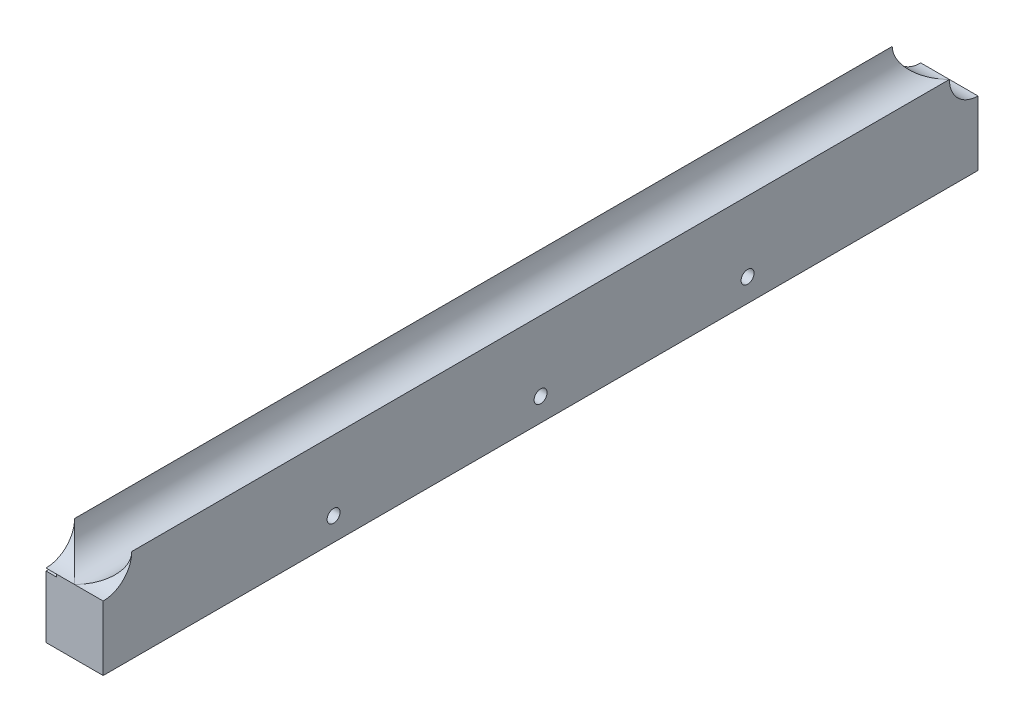
ISO-10303-21;
HEADER;
FILE_DESCRIPTION(('STEP AP214'),'2;1');
FILE_NAME('part.step','',(''),(''),'','','');
FILE_SCHEMA(('AUTOMOTIVE_DESIGN { 1 0 10303 214 1 1 1 1 }'));
ENDSEC;
DATA;
#1=APPLICATION_CONTEXT('core data for automotive mechanical design processes');
#2=APPLICATION_PROTOCOL_DEFINITION('international standard','automotive_design',2000,#1);
#3=PRODUCT_CONTEXT('',#1,'mechanical');
#4=PRODUCT('Part','Part','',(#3));
#5=PRODUCT_RELATED_PRODUCT_CATEGORY('part','',(#4));
#6=PRODUCT_DEFINITION_FORMATION('','',#4);
#7=PRODUCT_DEFINITION_CONTEXT('part definition',#1,'design');
#8=PRODUCT_DEFINITION('design','',#6,#7);
#9=PRODUCT_DEFINITION_SHAPE('','',#8);
#10=(LENGTH_UNIT() NAMED_UNIT(*) SI_UNIT(.MILLI.,.METRE.));
#11=(NAMED_UNIT(*) PLANE_ANGLE_UNIT() SI_UNIT($,.RADIAN.));
#12=(NAMED_UNIT(*) SI_UNIT($,.STERADIAN.) SOLID_ANGLE_UNIT());
#13=UNCERTAINTY_MEASURE_WITH_UNIT(LENGTH_MEASURE(1.E-05),#10,'distance_accuracy_value','');
#14=(GEOMETRIC_REPRESENTATION_CONTEXT(3) GLOBAL_UNCERTAINTY_ASSIGNED_CONTEXT((#13)) GLOBAL_UNIT_ASSIGNED_CONTEXT((#10,
#11,#12)) REPRESENTATION_CONTEXT('',''));
#15=CARTESIAN_POINT('',(0.,0.,0.));
#16=DIRECTION('',(0.,0.,1.));
#17=DIRECTION('',(1.,0.,0.));
#18=AXIS2_PLACEMENT_3D('',#15,#16,#17);
#19=CARTESIAN_POINT('',(-11.05,36.,-169.05));
#20=DIRECTION('',(1.,0.,0.));
#21=DIRECTION('',(0.,0.,-1.));
#22=AXIS2_PLACEMENT_3D('',#19,#20,#21);
#23=PLANE('',#22);
#24=CARTESIAN_POINT('',(-11.05,8.94000000000001,-80.));
#25=DIRECTION('',(1.,0.,0.));
#26=DIRECTION('',(0.,0.,-1.));
#27=AXIS2_PLACEMENT_3D('',#24,#25,#26);
#28=CIRCLE('',#27,2.49999999999998);
#29=CARTESIAN_POINT('',(-11.05,8.94000000000001,-82.5));
#30=VERTEX_POINT('',#29);
#31=EDGE_CURVE('E149',#30,#30,#28,.T.);
#32=ORIENTED_EDGE('',*,*,#31,.T.);
#33=EDGE_LOOP('',(#32));
#34=FACE_BOUND('',#33,.T.);
#35=CARTESIAN_POINT('',(-11.05,8.93999999999999,0.));
#36=DIRECTION('',(1.,0.,0.));
#37=DIRECTION('',(0.,0.,-1.));
#38=AXIS2_PLACEMENT_3D('',#35,#36,#37);
#39=CIRCLE('',#38,2.49999999999998);
#40=CARTESIAN_POINT('',(-11.05,8.93999999999999,-2.49999999999998));
#41=VERTEX_POINT('',#40);
#42=EDGE_CURVE('E236',#41,#41,#39,.T.);
#43=ORIENTED_EDGE('',*,*,#42,.T.);
#44=EDGE_LOOP('',(#43));
#45=FACE_BOUND('',#44,.T.);
#46=CARTESIAN_POINT('',(-11.05,8.93999999999999,80.));
#47=DIRECTION('',(1.,0.,0.));
#48=DIRECTION('',(0.,0.,-1.));
#49=AXIS2_PLACEMENT_3D('',#46,#47,#48);
#50=CIRCLE('',#49,2.49999999999998);
#51=CARTESIAN_POINT('',(-11.05,8.93999999999999,77.5));
#52=VERTEX_POINT('',#51);
#53=EDGE_CURVE('E224',#52,#52,#50,.T.);
#54=ORIENTED_EDGE('',*,*,#53,.T.);
#55=EDGE_LOOP('',(#54));
#56=FACE_BOUND('',#55,.T.);
#57=DIRECTION('',(0.,-1.,0.));
#58=VECTOR('',#57,1.);
#59=CARTESIAN_POINT('',(-11.05,36.,169.05));
#60=LINE('',#59,#58);
#61=CARTESIAN_POINT('',(-11.0500000000001,23.95,169.05));
#62=VERTEX_POINT('',#61);
#63=CARTESIAN_POINT('',(-11.05,0.,169.05));
#64=VERTEX_POINT('',#63);
#65=EDGE_CURVE('E177',#62,#64,#60,.T.);
#66=ORIENTED_EDGE('',*,*,#65,.F.);
#67=DIRECTION('',(0.,0.,-1.));
#68=VECTOR('',#67,1.);
#69=CARTESIAN_POINT('',(-11.0500000000001,23.95,169.05));
#70=LINE('',#69,#68);
#71=CARTESIAN_POINT('',(-11.0500000000001,23.95,-169.05));
#72=VERTEX_POINT('',#71);
#73=EDGE_CURVE('E216',#62,#72,#70,.T.);
#74=ORIENTED_EDGE('',*,*,#73,.T.);
#75=DIRECTION('',(0.,-1.,0.));
#76=VECTOR('',#75,1.);
#77=CARTESIAN_POINT('',(-11.05,36.,-169.05));
#78=LINE('',#77,#76);
#79=CARTESIAN_POINT('',(-11.05,0.,-169.05));
#80=VERTEX_POINT('',#79);
#81=EDGE_CURVE('E179',#72,#80,#78,.T.);
#82=ORIENTED_EDGE('',*,*,#81,.T.);
#83=DIRECTION('',(0.,0.,1.));
#84=VECTOR('',#83,1.);
#85=CARTESIAN_POINT('',(-11.05,0.,-169.05));
#86=LINE('',#85,#84);
#87=EDGE_CURVE('E171',#80,#64,#86,.T.);
#88=ORIENTED_EDGE('',*,*,#87,.T.);
#89=EDGE_LOOP('',(#66,#74,#82,#88));
#90=FACE_BOUND('',#89,.T.);
#91=ADVANCED_FACE('F39',(#34,#45,#56,#90),#23,.F.);
#92=CARTESIAN_POINT('',(11.05,36.,-169.05));
#93=DIRECTION('',(-1.,0.,0.));
#94=DIRECTION('',(0.,0.,1.));
#95=AXIS2_PLACEMENT_3D('',#92,#93,#94);
#96=PLANE('',#95);
#97=CARTESIAN_POINT('',(11.05,8.93999999999999,80.));
#98=DIRECTION('',(1.,0.,0.));
#99=DIRECTION('',(0.,0.,-1.));
#100=AXIS2_PLACEMENT_3D('',#97,#98,#99);
#101=CIRCLE('',#100,2.49999999999999);
#102=CARTESIAN_POINT('',(11.05,8.93999999999999,77.5));
#103=VERTEX_POINT('',#102);
#104=EDGE_CURVE('E220',#103,#103,#101,.T.);
#105=ORIENTED_EDGE('',*,*,#104,.F.);
#106=EDGE_LOOP('',(#105));
#107=FACE_BOUND('',#106,.T.);
#108=CARTESIAN_POINT('',(11.05,8.93999999999999,0.));
#109=DIRECTION('',(1.,0.,0.));
#110=DIRECTION('',(0.,0.,-1.));
#111=AXIS2_PLACEMENT_3D('',#108,#109,#110);
#112=CIRCLE('',#111,2.49999999999999);
#113=CARTESIAN_POINT('',(11.05,8.93999999999999,-2.49999999999999));
#114=VERTEX_POINT('',#113);
#115=EDGE_CURVE('E233',#114,#114,#112,.T.);
#116=ORIENTED_EDGE('',*,*,#115,.F.);
#117=EDGE_LOOP('',(#116));
#118=FACE_BOUND('',#117,.T.);
#119=CARTESIAN_POINT('',(11.05,8.94000000000001,-80.));
#120=DIRECTION('',(1.,0.,0.));
#121=DIRECTION('',(0.,0.,-1.));
#122=AXIS2_PLACEMENT_3D('',#119,#120,#121);
#123=CIRCLE('',#122,2.49999999999999);
#124=CARTESIAN_POINT('',(11.05,8.94000000000001,-82.5));
#125=VERTEX_POINT('',#124);
#126=EDGE_CURVE('E238',#125,#125,#123,.T.);
#127=ORIENTED_EDGE('',*,*,#126,.F.);
#128=EDGE_LOOP('',(#127));
#129=FACE_BOUND('',#128,.T.);
#130=DIRECTION('',(0.,0.,-1.));
#131=VECTOR('',#130,1.);
#132=CARTESIAN_POINT('',(11.05,36.,-169.05));
#133=LINE('',#132,#131);
#134=CARTESIAN_POINT('',(11.05,36.,158.));
#135=VERTEX_POINT('',#134);
#136=CARTESIAN_POINT('',(11.05,36.,-158.));
#137=VERTEX_POINT('',#136);
#138=EDGE_CURVE('E158',#135,#137,#133,.T.);
#139=ORIENTED_EDGE('',*,*,#138,.F.);
#140=CARTESIAN_POINT('',(11.05,36.,169.05));
#141=DIRECTION('',(1.,0.,0.));
#142=DIRECTION('',(0.,0.,-1.));
#143=AXIS2_PLACEMENT_3D('',#140,#141,#142);
#144=CIRCLE('',#143,11.05);
#145=CARTESIAN_POINT('',(11.05,24.95,169.05));
#146=VERTEX_POINT('',#145);
#147=EDGE_CURVE('E143',#146,#135,#144,.T.);
#148=ORIENTED_EDGE('',*,*,#147,.F.);
#149=DIRECTION('',(0.,-1.,0.));
#150=VECTOR('',#149,1.);
#151=CARTESIAN_POINT('',(11.05,36.,169.05));
#152=LINE('',#151,#150);
#153=CARTESIAN_POINT('',(11.05,0.,169.05));
#154=VERTEX_POINT('',#153);
#155=EDGE_CURVE('E164',#146,#154,#152,.T.);
#156=ORIENTED_EDGE('',*,*,#155,.T.);
#157=DIRECTION('',(0.,0.,-1.));
#158=VECTOR('',#157,1.);
#159=CARTESIAN_POINT('',(11.05,0.,-169.05));
#160=LINE('',#159,#158);
#161=CARTESIAN_POINT('',(11.05,0.,-169.05));
#162=VERTEX_POINT('',#161);
#163=EDGE_CURVE('E165',#154,#162,#160,.T.);
#164=ORIENTED_EDGE('',*,*,#163,.T.);
#165=DIRECTION('',(0.,-1.,0.));
#166=VECTOR('',#165,1.);
#167=CARTESIAN_POINT('',(11.05,36.,-169.05));
#168=LINE('',#167,#166);
#169=CARTESIAN_POINT('',(11.05,24.95,-169.05));
#170=VERTEX_POINT('',#169);
#171=EDGE_CURVE('E181',#170,#162,#168,.T.);
#172=ORIENTED_EDGE('',*,*,#171,.F.);
#173=CARTESIAN_POINT('',(11.05,36.,-169.05));
#174=DIRECTION('',(1.,0.,0.));
#175=DIRECTION('',(0.,0.,-1.));
#176=AXIS2_PLACEMENT_3D('',#173,#174,#175);
#177=CIRCLE('',#176,11.05);
#178=EDGE_CURVE('E153',#137,#170,#177,.T.);
#179=ORIENTED_EDGE('',*,*,#178,.F.);
#180=EDGE_LOOP('',(#139,#148,#156,#164,#172,#179));
#181=FACE_BOUND('',#180,.T.);
#182=ADVANCED_FACE('F41',(#107,#118,#129,#181),#96,.F.);
#183=CARTESIAN_POINT('',(-11.05,36.,-169.05));
#184=DIRECTION('',(0.,0.,1.));
#185=DIRECTION('',(1.,0.,0.));
#186=AXIS2_PLACEMENT_3D('',#183,#184,#185);
#187=PLANE('',#186);
#188=CARTESIAN_POINT('',(5.52499999999999,17.9625,-169.05));
#189=DIRECTION('',(0.,0.,-1.));
#190=DIRECTION('',(-1.,0.,0.));
#191=AXIS2_PLACEMENT_3D('',#188,#189,#190);
#192=CIRCLE('',#191,2.5);
#193=CARTESIAN_POINT('',(3.02499999999999,17.9625,-169.05));
#194=VERTEX_POINT('',#193);
#195=EDGE_CURVE('E279',#194,#194,#192,.T.);
#196=ORIENTED_EDGE('',*,*,#195,.F.);
#197=EDGE_LOOP('',(#196));
#198=FACE_BOUND('',#197,.T.);
#199=CARTESIAN_POINT('',(-5.52500000000001,5.9875,-169.05));
#200=DIRECTION('',(0.,0.,-1.));
#201=DIRECTION('',(-1.,0.,0.));
#202=AXIS2_PLACEMENT_3D('',#199,#200,#201);
#203=CIRCLE('',#202,2.5);
#204=CARTESIAN_POINT('',(-8.02500000000001,5.9875,-169.05));
#205=VERTEX_POINT('',#204);
#206=EDGE_CURVE('E282',#205,#205,#203,.T.);
#207=ORIENTED_EDGE('',*,*,#206,.F.);
#208=EDGE_LOOP('',(#207));
#209=FACE_BOUND('',#208,.T.);
#210=ORIENTED_EDGE('',*,*,#81,.F.);
#211=DIRECTION('',(-1.,0.,0.));
#212=VECTOR('',#211,1.);
#213=CARTESIAN_POINT('',(-11.0500000000001,23.95,-169.05));
#214=LINE('',#213,#212);
#215=CARTESIAN_POINT('',(-7.05000000000006,23.95,-169.05));
#216=VERTEX_POINT('',#215);
#217=EDGE_CURVE('E128',#216,#72,#214,.T.);
#218=ORIENTED_EDGE('',*,*,#217,.F.);
#219=DIRECTION('',(0.,-1.,0.));
#220=VECTOR('',#219,1.);
#221=CARTESIAN_POINT('',(-7.05000000000006,24.95,-169.05));
#222=LINE('',#221,#220);
#223=CARTESIAN_POINT('',(-7.05000000000006,24.95,-169.05));
#224=VERTEX_POINT('',#223);
#225=EDGE_CURVE('E291',#224,#216,#222,.T.);
#226=ORIENTED_EDGE('',*,*,#225,.F.);
#227=DIRECTION('',(1.,0.,0.));
#228=VECTOR('',#227,1.);
#229=CARTESIAN_POINT('',(-11.0500000000001,24.95,-169.05));
#230=LINE('',#229,#228);
#231=CARTESIAN_POINT('',(0.,24.95,-169.05));
#232=VERTEX_POINT('',#231);
#233=EDGE_CURVE('E62',#224,#232,#230,.T.);
#234=ORIENTED_EDGE('',*,*,#233,.T.);
#235=EDGE_CURVE('E142',#232,#170,#230,.T.);
#236=ORIENTED_EDGE('',*,*,#235,.T.);
#237=ORIENTED_EDGE('',*,*,#171,.T.);
#238=DIRECTION('',(-1.,0.,0.));
#239=VECTOR('',#238,1.);
#240=CARTESIAN_POINT('',(-11.05,0.,-169.05));
#241=LINE('',#240,#239);
#242=EDGE_CURVE('E168',#162,#80,#241,.T.);
#243=ORIENTED_EDGE('',*,*,#242,.T.);
#244=EDGE_LOOP('',(#210,#218,#226,#234,#236,#237,#243));
#245=FACE_BOUND('',#244,.T.);
#246=ADVANCED_FACE('F205',(#198,#209,#245),#187,.F.);
#247=CARTESIAN_POINT('',(-11.0500000000001,36.,-169.05));
#248=DIRECTION('',(1.,0.,0.));
#249=DIRECTION('',(0.,0.,-1.));
#250=AXIS2_PLACEMENT_3D('',#247,#248,#249);
#251=CIRCLE('',#250,11.05);
#252=CARTESIAN_POINT('',(-11.0500000000001,36.,-158.));
#253=VERTEX_POINT('',#252);
#254=CARTESIAN_POINT('',(-11.0500000000001,24.95,-169.05));
#255=VERTEX_POINT('',#254);
#256=EDGE_CURVE('E137',#253,#255,#251,.T.);
#257=ORIENTED_EDGE('',*,*,#256,.T.);
#258=DIRECTION('',(0.,0.,-1.));
#259=VECTOR('',#258,1.);
#260=CARTESIAN_POINT('',(-11.0500000000001,24.95,169.05));
#261=LINE('',#260,#259);
#262=CARTESIAN_POINT('',(-11.0500000000001,24.95,169.05));
#263=VERTEX_POINT('',#262);
#264=EDGE_CURVE('E121',#263,#255,#261,.T.);
#265=ORIENTED_EDGE('',*,*,#264,.F.);
#266=CARTESIAN_POINT('',(-11.05,36.,169.05));
#267=DIRECTION('',(1.,0.,0.));
#268=DIRECTION('',(0.,0.,-1.));
#269=AXIS2_PLACEMENT_3D('',#266,#267,#268);
#270=CIRCLE('',#269,11.05);
#271=CARTESIAN_POINT('',(-11.05,36.,158.));
#272=VERTEX_POINT('',#271);
#273=EDGE_CURVE('E135',#263,#272,#270,.T.);
#274=ORIENTED_EDGE('',*,*,#273,.T.);
#275=DIRECTION('',(0.,0.,1.));
#276=VECTOR('',#275,1.);
#277=CARTESIAN_POINT('',(-11.05,36.,-169.05));
#278=LINE('',#277,#276);
#279=EDGE_CURVE('E161',#253,#272,#278,.T.);
#280=ORIENTED_EDGE('',*,*,#279,.F.);
#281=EDGE_LOOP('',(#257,#265,#274,#280));
#282=FACE_BOUND('',#281,.T.);
#283=ADVANCED_FACE('F133',(#282),#23,.F.);
#284=CARTESIAN_POINT('',(-11.05,36.,169.05));
#285=DIRECTION('',(0.,0.,-1.));
#286=DIRECTION('',(-1.,0.,0.));
#287=AXIS2_PLACEMENT_3D('',#284,#285,#286);
#288=PLANE('',#287);
#289=DIRECTION('',(0.,-1.,0.));
#290=VECTOR('',#289,1.);
#291=CARTESIAN_POINT('',(-7.05000000000006,24.95,169.05));
#292=LINE('',#291,#290);
#293=CARTESIAN_POINT('',(-7.05000000000006,24.95,169.05));
#294=VERTEX_POINT('',#293);
#295=CARTESIAN_POINT('',(-7.05000000000006,23.95,169.05));
#296=VERTEX_POINT('',#295);
#297=EDGE_CURVE('E54',#294,#296,#292,.T.);
#298=ORIENTED_EDGE('',*,*,#297,.T.);
#299=DIRECTION('',(-1.,0.,0.));
#300=VECTOR('',#299,1.);
#301=CARTESIAN_POINT('',(-11.0500000000001,23.95,169.05));
#302=LINE('',#301,#300);
#303=EDGE_CURVE('E138',#296,#62,#302,.T.);
#304=ORIENTED_EDGE('',*,*,#303,.T.);
#305=ORIENTED_EDGE('',*,*,#65,.T.);
#306=DIRECTION('',(1.,0.,0.));
#307=VECTOR('',#306,1.);
#308=CARTESIAN_POINT('',(-11.05,0.,169.05));
#309=LINE('',#308,#307);
#310=EDGE_CURVE('E162',#64,#154,#309,.T.);
#311=ORIENTED_EDGE('',*,*,#310,.T.);
#312=ORIENTED_EDGE('',*,*,#155,.F.);
#313=DIRECTION('',(1.,0.,0.));
#314=VECTOR('',#313,1.);
#315=CARTESIAN_POINT('',(-11.05,24.95,169.05));
#316=LINE('',#315,#314);
#317=CARTESIAN_POINT('',(0.,24.95,169.05));
#318=VERTEX_POINT('',#317);
#319=EDGE_CURVE('E157',#146,#318,#316,.F.);
#320=ORIENTED_EDGE('',*,*,#319,.T.);
#321=EDGE_CURVE('E155',#318,#294,#316,.F.);
#322=ORIENTED_EDGE('',*,*,#321,.T.);
#323=EDGE_LOOP('',(#298,#304,#305,#311,#312,#320,#322));
#324=FACE_BOUND('',#323,.T.);
#325=ADVANCED_FACE('F194',(#324),#288,.F.);
#326=CARTESIAN_POINT('',(0.,0.,0.));
#327=DIRECTION('',(0.,1.,0.));
#328=DIRECTION('',(0.,0.,1.));
#329=AXIS2_PLACEMENT_3D('',#326,#327,#328);
#330=PLANE('',#329);
#331=ORIENTED_EDGE('',*,*,#163,.F.);
#332=ORIENTED_EDGE('',*,*,#310,.F.);
#333=ORIENTED_EDGE('',*,*,#87,.F.);
#334=ORIENTED_EDGE('',*,*,#242,.F.);
#335=EDGE_LOOP('',(#331,#332,#333,#334));
#336=FACE_BOUND('',#335,.T.);
#337=ADVANCED_FACE('F210',(#336),#330,.F.);
#338=CARTESIAN_POINT('',(0.,36.,-169.051));
#339=DIRECTION('',(0.,0.,1.));
#340=DIRECTION('',(1.,0.,0.));
#341=AXIS2_PLACEMENT_3D('',#338,#339,#340);
#342=CYLINDRICAL_SURFACE('',#341,11.05);
#343=CARTESIAN_POINT('',(0.,36.,169.05));
#344=DIRECTION('',(-0.707106781186547,0.,0.707106781186548));
#345=DIRECTION('',(0.707106781186548,0.,0.707106781186547));
#346=AXIS2_PLACEMENT_3D('',#343,#344,#345);
#347=ELLIPSE('',#346,15.6270598642227,11.05);
#348=EDGE_CURVE('E47',#272,#318,#347,.T.);
#349=ORIENTED_EDGE('',*,*,#348,.T.);
#350=CARTESIAN_POINT('',(0.,36.,169.05));
#351=DIRECTION('',(0.707106781186548,0.,0.707106781186547));
#352=DIRECTION('',(-0.707106781186547,0.,0.707106781186548));
#353=AXIS2_PLACEMENT_3D('',#350,#351,#352);
#354=ELLIPSE('',#353,15.6270598642227,11.05);
#355=EDGE_CURVE('E11',#318,#135,#354,.T.);
#356=ORIENTED_EDGE('',*,*,#355,.T.);
#357=ORIENTED_EDGE('',*,*,#138,.T.);
#358=CARTESIAN_POINT('',(0.,36.,-169.05));
#359=DIRECTION('',(-0.707106781186547,0.,0.707106781186548));
#360=DIRECTION('',(0.707106781186548,0.,0.707106781186547));
#361=AXIS2_PLACEMENT_3D('',#358,#359,#360);
#362=ELLIPSE('',#361,15.6270598642227,11.05);
#363=EDGE_CURVE('E183',#137,#232,#362,.F.);
#364=ORIENTED_EDGE('',*,*,#363,.T.);
#365=CARTESIAN_POINT('',(0.,36.,-169.05));
#366=DIRECTION('',(0.707106781186548,0.,0.707106781186547));
#367=DIRECTION('',(-0.707106781186547,0.,0.707106781186548));
#368=AXIS2_PLACEMENT_3D('',#365,#366,#367);
#369=ELLIPSE('',#368,15.6270598642227,11.05);
#370=EDGE_CURVE('E186',#232,#253,#369,.F.);
#371=ORIENTED_EDGE('',*,*,#370,.T.);
#372=ORIENTED_EDGE('',*,*,#279,.T.);
#373=EDGE_LOOP('',(#349,#356,#357,#364,#371,#372));
#374=FACE_BOUND('',#373,.T.);
#375=ADVANCED_FACE('F190',(#374),#342,.F.);
#376=CARTESIAN_POINT('',(-11.0500000000001,36.,-169.05));
#377=DIRECTION('',(1.,0.,0.));
#378=DIRECTION('',(0.,0.,-1.));
#379=AXIS2_PLACEMENT_3D('',#376,#377,#378);
#380=CYLINDRICAL_SURFACE('',#379,11.05);
#381=ORIENTED_EDGE('',*,*,#363,.F.);
#382=ORIENTED_EDGE('',*,*,#178,.T.);
#383=ORIENTED_EDGE('',*,*,#235,.F.);
#384=EDGE_LOOP('',(#381,#382,#383));
#385=FACE_BOUND('',#384,.T.);
#386=ADVANCED_FACE('F203',(#385),#380,.F.);
#387=ORIENTED_EDGE('',*,*,#256,.F.);
#388=ORIENTED_EDGE('',*,*,#370,.F.);
#389=ORIENTED_EDGE('',*,*,#233,.F.);
#390=EDGE_CURVE('E146',#255,#224,#230,.T.);
#391=ORIENTED_EDGE('',*,*,#390,.F.);
#392=EDGE_LOOP('',(#387,#388,#389,#391));
#393=FACE_BOUND('',#392,.T.);
#394=ADVANCED_FACE('F406',(#393),#380,.F.);
#395=CARTESIAN_POINT('',(-11.05,36.,169.05));
#396=DIRECTION('',(1.,0.,0.));
#397=DIRECTION('',(0.,0.,-1.));
#398=AXIS2_PLACEMENT_3D('',#395,#396,#397);
#399=CYLINDRICAL_SURFACE('',#398,11.05);
#400=ORIENTED_EDGE('',*,*,#348,.F.);
#401=ORIENTED_EDGE('',*,*,#273,.F.);
#402=DIRECTION('',(1.,0.,0.));
#403=VECTOR('',#402,1.);
#404=CARTESIAN_POINT('',(-11.0500000000001,24.95,169.05));
#405=LINE('',#404,#403);
#406=EDGE_CURVE('E117',#263,#294,#405,.T.);
#407=ORIENTED_EDGE('',*,*,#406,.T.);
#408=ORIENTED_EDGE('',*,*,#321,.F.);
#409=EDGE_LOOP('',(#400,#401,#407,#408));
#410=FACE_BOUND('',#409,.T.);
#411=ADVANCED_FACE('F140',(#410),#399,.F.);
#412=ORIENTED_EDGE('',*,*,#147,.T.);
#413=ORIENTED_EDGE('',*,*,#355,.F.);
#414=ORIENTED_EDGE('',*,*,#319,.F.);
#415=EDGE_LOOP('',(#412,#413,#414));
#416=FACE_BOUND('',#415,.T.);
#417=ADVANCED_FACE('F197',(#416),#399,.F.);
#418=CARTESIAN_POINT('',(11.05,8.94000000000001,-80.));
#419=DIRECTION('',(1.,0.,0.));
#420=DIRECTION('',(0.,0.,-1.));
#421=AXIS2_PLACEMENT_3D('',#418,#419,#420);
#422=CYLINDRICAL_SURFACE('',#421,2.49999999999999);
#423=ORIENTED_EDGE('',*,*,#31,.F.);
#424=EDGE_LOOP('',(#423));
#425=FACE_BOUND('',#424,.T.);
#426=ORIENTED_EDGE('',*,*,#126,.T.);
#427=EDGE_LOOP('',(#426));
#428=FACE_BOUND('',#427,.T.);
#429=ADVANCED_FACE('F247',(#425,#428),#422,.F.);
#430=CARTESIAN_POINT('',(11.05,8.93999999999999,0.));
#431=DIRECTION('',(1.,0.,0.));
#432=DIRECTION('',(0.,0.,-1.));
#433=AXIS2_PLACEMENT_3D('',#430,#431,#432);
#434=CYLINDRICAL_SURFACE('',#433,2.49999999999999);
#435=ORIENTED_EDGE('',*,*,#42,.F.);
#436=EDGE_LOOP('',(#435));
#437=FACE_BOUND('',#436,.T.);
#438=ORIENTED_EDGE('',*,*,#115,.T.);
#439=EDGE_LOOP('',(#438));
#440=FACE_BOUND('',#439,.T.);
#441=ADVANCED_FACE('F249',(#437,#440),#434,.F.);
#442=CARTESIAN_POINT('',(11.05,8.93999999999999,80.));
#443=DIRECTION('',(1.,0.,0.));
#444=DIRECTION('',(0.,0.,-1.));
#445=AXIS2_PLACEMENT_3D('',#442,#443,#444);
#446=CYLINDRICAL_SURFACE('',#445,2.49999999999999);
#447=ORIENTED_EDGE('',*,*,#53,.F.);
#448=EDGE_LOOP('',(#447));
#449=FACE_BOUND('',#448,.T.);
#450=ORIENTED_EDGE('',*,*,#104,.T.);
#451=EDGE_LOOP('',(#450));
#452=FACE_BOUND('',#451,.T.);
#453=ADVANCED_FACE('F255',(#449,#452),#446,.F.);
#454=CARTESIAN_POINT('',(-11.0500000000001,23.95,169.05));
#455=DIRECTION('',(0.,-1.,0.));
#456=DIRECTION('',(0.,0.,-1.));
#457=AXIS2_PLACEMENT_3D('',#454,#455,#456);
#458=PLANE('',#457);
#459=ORIENTED_EDGE('',*,*,#217,.T.);
#460=ORIENTED_EDGE('',*,*,#73,.F.);
#461=ORIENTED_EDGE('',*,*,#303,.F.);
#462=DIRECTION('',(0.,0.,-1.));
#463=VECTOR('',#462,1.);
#464=CARTESIAN_POINT('',(-7.05000000000006,23.95,169.05));
#465=LINE('',#464,#463);
#466=EDGE_CURVE('E221',#296,#216,#465,.T.);
#467=ORIENTED_EDGE('',*,*,#466,.T.);
#468=EDGE_LOOP('',(#459,#460,#461,#467));
#469=FACE_BOUND('',#468,.T.);
#470=ADVANCED_FACE('F317',(#469),#458,.F.);
#471=CARTESIAN_POINT('',(-7.05000000000006,24.95,169.05));
#472=DIRECTION('',(1.,0.,0.));
#473=DIRECTION('',(0.,0.,-1.));
#474=AXIS2_PLACEMENT_3D('',#471,#472,#473);
#475=PLANE('',#474);
#476=ORIENTED_EDGE('',*,*,#225,.T.);
#477=ORIENTED_EDGE('',*,*,#466,.F.);
#478=ORIENTED_EDGE('',*,*,#297,.F.);
#479=DIRECTION('',(0.,0.,-1.));
#480=VECTOR('',#479,1.);
#481=CARTESIAN_POINT('',(-7.05000000000006,24.95,169.05));
#482=LINE('',#481,#480);
#483=EDGE_CURVE('E123',#294,#224,#482,.T.);
#484=ORIENTED_EDGE('',*,*,#483,.T.);
#485=EDGE_LOOP('',(#476,#477,#478,#484));
#486=FACE_BOUND('',#485,.T.);
#487=ADVANCED_FACE('F320',(#486),#475,.F.);
#488=CARTESIAN_POINT('',(-11.0500000000001,24.95,169.05));
#489=DIRECTION('',(0.,1.,0.));
#490=DIRECTION('',(0.,0.,1.));
#491=AXIS2_PLACEMENT_3D('',#488,#489,#490);
#492=PLANE('',#491);
#493=ORIENTED_EDGE('',*,*,#390,.T.);
#494=ORIENTED_EDGE('',*,*,#483,.F.);
#495=ORIENTED_EDGE('',*,*,#406,.F.);
#496=ORIENTED_EDGE('',*,*,#264,.T.);
#497=EDGE_LOOP('',(#493,#494,#495,#496));
#498=FACE_BOUND('',#497,.T.);
#499=ADVANCED_FACE('F120',(#498),#492,.F.);
#500=CARTESIAN_POINT('',(-5.52500000000001,5.9875,-159.05));
#501=DIRECTION('',(0.,0.,-1.));
#502=DIRECTION('',(-1.,0.,0.));
#503=AXIS2_PLACEMENT_3D('',#500,#501,#502);
#504=CYLINDRICAL_SURFACE('',#503,2.5);
#505=CARTESIAN_POINT('',(-5.52500000000001,5.9875,-159.05));
#506=DIRECTION('',(0.,0.,-1.));
#507=DIRECTION('',(-1.,0.,0.));
#508=AXIS2_PLACEMENT_3D('',#505,#506,#507);
#509=CIRCLE('',#508,2.5);
#510=CARTESIAN_POINT('',(-8.02500000000001,5.9875,-159.05));
#511=VERTEX_POINT('',#510);
#512=EDGE_CURVE('E284',#511,#511,#509,.T.);
#513=ORIENTED_EDGE('',*,*,#512,.F.);
#514=EDGE_LOOP('',(#513));
#515=FACE_BOUND('',#514,.T.);
#516=ORIENTED_EDGE('',*,*,#206,.T.);
#517=EDGE_LOOP('',(#516));
#518=FACE_BOUND('',#517,.T.);
#519=ADVANCED_FACE('F310',(#515,#518),#504,.F.);
#520=CARTESIAN_POINT('',(-5.52500000000001,5.9875,-159.05));
#521=DIRECTION('',(0.,0.,-1.));
#522=DIRECTION('',(-1.,0.,0.));
#523=AXIS2_PLACEMENT_3D('',#520,#521,#522);
#524=PLANE('',#523);
#525=ORIENTED_EDGE('',*,*,#512,.T.);
#526=EDGE_LOOP('',(#525));
#527=FACE_BOUND('',#526,.T.);
#528=ADVANCED_FACE('F302',(#527),#524,.T.);
#529=CARTESIAN_POINT('',(5.52499999999999,17.9625,-159.05));
#530=DIRECTION('',(0.,0.,-1.));
#531=DIRECTION('',(-1.,0.,0.));
#532=AXIS2_PLACEMENT_3D('',#529,#530,#531);
#533=CYLINDRICAL_SURFACE('',#532,2.5);
#534=CARTESIAN_POINT('',(5.52499999999999,17.9625,-159.05));
#535=DIRECTION('',(0.,0.,-1.));
#536=DIRECTION('',(-1.,0.,0.));
#537=AXIS2_PLACEMENT_3D('',#534,#535,#536);
#538=CIRCLE('',#537,2.5);
#539=CARTESIAN_POINT('',(3.02499999999999,17.9625,-159.05));
#540=VERTEX_POINT('',#539);
#541=EDGE_CURVE('E293',#540,#540,#538,.T.);
#542=ORIENTED_EDGE('',*,*,#541,.F.);
#543=EDGE_LOOP('',(#542));
#544=FACE_BOUND('',#543,.T.);
#545=ORIENTED_EDGE('',*,*,#195,.T.);
#546=EDGE_LOOP('',(#545));
#547=FACE_BOUND('',#546,.T.);
#548=ADVANCED_FACE('F299',(#544,#547),#533,.F.);
#549=CARTESIAN_POINT('',(5.52499999999999,17.9625,-159.05));
#550=DIRECTION('',(0.,0.,-1.));
#551=DIRECTION('',(-1.,0.,0.));
#552=AXIS2_PLACEMENT_3D('',#549,#550,#551);
#553=PLANE('',#552);
#554=ORIENTED_EDGE('',*,*,#541,.T.);
#555=EDGE_LOOP('',(#554));
#556=FACE_BOUND('',#555,.T.);
#557=ADVANCED_FACE('F301',(#556),#553,.T.);
#558=CLOSED_SHELL('',(#91,#182,#246,#283,#325,#337,#375,#386,#394,#411,#417,#429,#441,#453,#470,
#487,#499,#519,#528,#548,#557));
#559=MANIFOLD_SOLID_BREP('B2',#558);
#560=ADVANCED_BREP_SHAPE_REPRESENTATION('',(#18,#559),#14);
#561=SHAPE_DEFINITION_REPRESENTATION(#9,#560);
ENDSEC;
END-ISO-10303-21;
